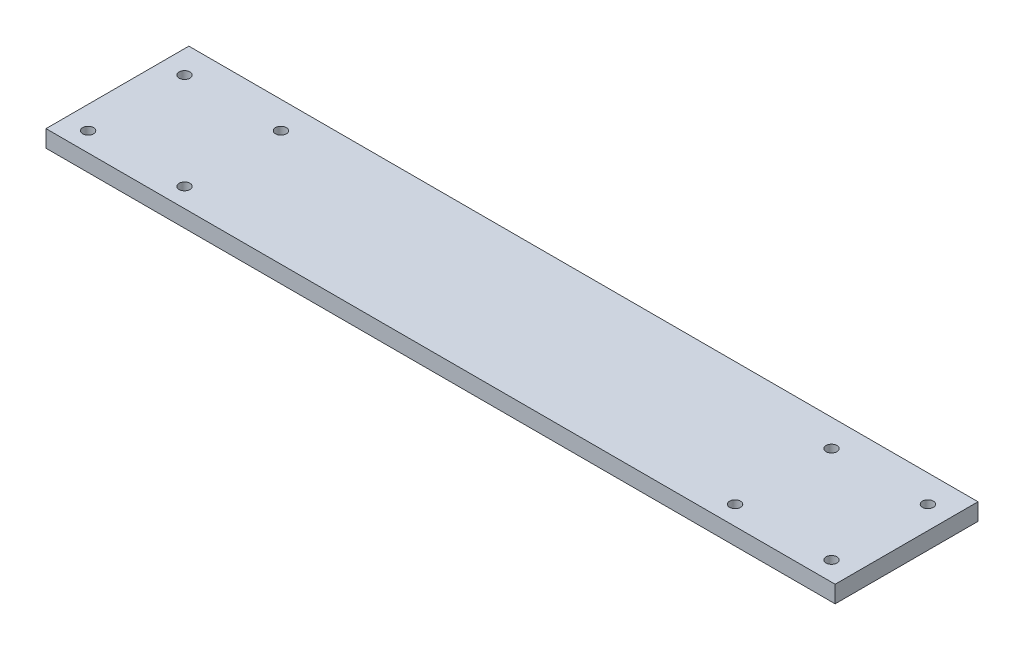
ISO-10303-21;
HEADER;
FILE_DESCRIPTION(('STEP AP214'),'2;1');
FILE_NAME('part.step','',(''),(''),'','','');
FILE_SCHEMA(('AUTOMOTIVE_DESIGN { 1 0 10303 214 1 1 1 1 }'));
ENDSEC;
DATA;
#1=APPLICATION_CONTEXT('core data for automotive mechanical design processes');
#2=APPLICATION_PROTOCOL_DEFINITION('international standard','automotive_design',2000,#1);
#3=PRODUCT_CONTEXT('',#1,'mechanical');
#4=PRODUCT('Part','Part','',(#3));
#5=PRODUCT_RELATED_PRODUCT_CATEGORY('part','',(#4));
#6=PRODUCT_DEFINITION_FORMATION('','',#4);
#7=PRODUCT_DEFINITION_CONTEXT('part definition',#1,'design');
#8=PRODUCT_DEFINITION('design','',#6,#7);
#9=PRODUCT_DEFINITION_SHAPE('','',#8);
#10=(LENGTH_UNIT() NAMED_UNIT(*) SI_UNIT(.MILLI.,.METRE.));
#11=(NAMED_UNIT(*) PLANE_ANGLE_UNIT() SI_UNIT($,.RADIAN.));
#12=(NAMED_UNIT(*) SI_UNIT($,.STERADIAN.) SOLID_ANGLE_UNIT());
#13=UNCERTAINTY_MEASURE_WITH_UNIT(LENGTH_MEASURE(1.E-05),#10,'distance_accuracy_value','');
#14=(GEOMETRIC_REPRESENTATION_CONTEXT(3) GLOBAL_UNCERTAINTY_ASSIGNED_CONTEXT((#13)) GLOBAL_UNIT_ASSIGNED_CONTEXT((#10,
#11,#12)) REPRESENTATION_CONTEXT('',''));
#15=CARTESIAN_POINT('',(0.,0.,0.));
#16=DIRECTION('',(0.,0.,1.));
#17=DIRECTION('',(1.,0.,0.));
#18=AXIS2_PLACEMENT_3D('',#15,#16,#17);
#19=CARTESIAN_POINT('',(0.,3.175,0.));
#20=DIRECTION('',(0.,1.,0.));
#21=DIRECTION('',(0.,0.,1.));
#22=AXIS2_PLACEMENT_3D('',#19,#20,#21);
#23=PLANE('',#22);
#24=CARTESIAN_POINT('',(-69.3885,3.175,-21.59));
#25=DIRECTION('',(0.,1.,0.));
#26=DIRECTION('',(0.,0.,-1.));
#27=AXIS2_PLACEMENT_3D('',#24,#25,#26);
#28=CIRCLE('',#27,1.016);
#29=CARTESIAN_POINT('',(-69.3885,3.175,-22.606));
#30=VERTEX_POINT('',#29);
#31=EDGE_CURVE('E144',#30,#30,#28,.T.);
#32=ORIENTED_EDGE('',*,*,#31,.F.);
#33=EDGE_LOOP('',(#32));
#34=FACE_BOUND('',#33,.T.);
#35=CARTESIAN_POINT('',(-69.3885,3.175,-3.59));
#36=DIRECTION('',(0.,1.,0.));
#37=DIRECTION('',(0.,0.,-1.));
#38=AXIS2_PLACEMENT_3D('',#35,#36,#37);
#39=CIRCLE('',#38,1.016);
#40=CARTESIAN_POINT('',(-69.3885,3.175,-4.60600000000001));
#41=VERTEX_POINT('',#40);
#42=EDGE_CURVE('E132',#41,#41,#39,.T.);
#43=ORIENTED_EDGE('',*,*,#42,.F.);
#44=EDGE_LOOP('',(#43));
#45=FACE_BOUND('',#44,.T.);
#46=CARTESIAN_POINT('',(51.3885,3.175,-3.59000000000002));
#47=DIRECTION('',(0.,1.,0.));
#48=DIRECTION('',(0.,0.,1.));
#49=AXIS2_PLACEMENT_3D('',#46,#47,#48);
#50=CIRCLE('',#49,1.016);
#51=CARTESIAN_POINT('',(51.3885,3.175,-2.57400000000002));
#52=VERTEX_POINT('',#51);
#53=EDGE_CURVE('E120',#52,#52,#50,.T.);
#54=ORIENTED_EDGE('',*,*,#53,.F.);
#55=EDGE_LOOP('',(#54));
#56=FACE_BOUND('',#55,.T.);
#57=CARTESIAN_POINT('',(51.3885,3.175,-21.59));
#58=DIRECTION('',(0.,1.,0.));
#59=DIRECTION('',(0.,0.,1.));
#60=AXIS2_PLACEMENT_3D('',#57,#58,#59);
#61=CIRCLE('',#60,1.016);
#62=CARTESIAN_POINT('',(51.3885,3.175,-20.574));
#63=VERTEX_POINT('',#62);
#64=EDGE_CURVE('E99',#63,#63,#61,.T.);
#65=ORIENTED_EDGE('',*,*,#64,.F.);
#66=EDGE_LOOP('',(#65));
#67=FACE_BOUND('',#66,.T.);
#68=DIRECTION('',(0.,0.,1.));
#69=VECTOR('',#68,1.);
#70=CARTESIAN_POINT('',(-73.66,3.175,0.));
#71=LINE('',#70,#69);
#72=CARTESIAN_POINT('',(-73.66,3.175,-26.67));
#73=VERTEX_POINT('',#72);
#74=CARTESIAN_POINT('',(-73.66,3.175,0.));
#75=VERTEX_POINT('',#74);
#76=EDGE_CURVE('E84',#73,#75,#71,.T.);
#77=ORIENTED_EDGE('',*,*,#76,.T.);
#78=DIRECTION('',(1.,0.,0.));
#79=VECTOR('',#78,1.);
#80=CARTESIAN_POINT('',(73.66,3.175,0.));
#81=LINE('',#80,#79);
#82=CARTESIAN_POINT('',(73.66,3.175,0.));
#83=VERTEX_POINT('',#82);
#84=EDGE_CURVE('E79',#75,#83,#81,.T.);
#85=ORIENTED_EDGE('',*,*,#84,.T.);
#86=DIRECTION('',(0.,0.,-1.));
#87=VECTOR('',#86,1.);
#88=CARTESIAN_POINT('',(73.66,3.175,0.));
#89=LINE('',#88,#87);
#90=CARTESIAN_POINT('',(73.66,3.175,-26.67));
#91=VERTEX_POINT('',#90);
#92=EDGE_CURVE('E82',#83,#91,#89,.T.);
#93=ORIENTED_EDGE('',*,*,#92,.T.);
#94=DIRECTION('',(-1.,0.,0.));
#95=VECTOR('',#94,1.);
#96=CARTESIAN_POINT('',(73.66,3.175,-26.67));
#97=LINE('',#96,#95);
#98=EDGE_CURVE('E49',#91,#73,#97,.T.);
#99=ORIENTED_EDGE('',*,*,#98,.T.);
#100=EDGE_LOOP('',(#77,#85,#93,#99));
#101=FACE_BOUND('',#100,.T.);
#102=CARTESIAN_POINT('',(69.3885,3.175,-21.59));
#103=DIRECTION('',(0.,1.,0.));
#104=DIRECTION('',(0.,0.,1.));
#105=AXIS2_PLACEMENT_3D('',#102,#103,#104);
#106=CIRCLE('',#105,1.016);
#107=CARTESIAN_POINT('',(69.3885,3.175,-20.574));
#108=VERTEX_POINT('',#107);
#109=EDGE_CURVE('E114',#108,#108,#106,.T.);
#110=ORIENTED_EDGE('',*,*,#109,.F.);
#111=EDGE_LOOP('',(#110));
#112=FACE_BOUND('',#111,.T.);
#113=CARTESIAN_POINT('',(69.3885,3.175,-3.59000000000002));
#114=DIRECTION('',(0.,1.,0.));
#115=DIRECTION('',(0.,0.,1.));
#116=AXIS2_PLACEMENT_3D('',#113,#114,#115);
#117=CIRCLE('',#116,1.016);
#118=CARTESIAN_POINT('',(69.3885,3.175,-2.57400000000002));
#119=VERTEX_POINT('',#118);
#120=EDGE_CURVE('E126',#119,#119,#117,.T.);
#121=ORIENTED_EDGE('',*,*,#120,.F.);
#122=EDGE_LOOP('',(#121));
#123=FACE_BOUND('',#122,.T.);
#124=CARTESIAN_POINT('',(-51.3885,3.175,-3.59000000000001));
#125=DIRECTION('',(0.,1.,0.));
#126=DIRECTION('',(0.,0.,-1.));
#127=AXIS2_PLACEMENT_3D('',#124,#125,#126);
#128=CIRCLE('',#127,1.016);
#129=CARTESIAN_POINT('',(-51.3885,3.175,-4.60600000000001));
#130=VERTEX_POINT('',#129);
#131=EDGE_CURVE('E138',#130,#130,#128,.T.);
#132=ORIENTED_EDGE('',*,*,#131,.F.);
#133=EDGE_LOOP('',(#132));
#134=FACE_BOUND('',#133,.T.);
#135=CARTESIAN_POINT('',(-51.3885,3.175,-21.59));
#136=DIRECTION('',(0.,1.,0.));
#137=DIRECTION('',(0.,0.,-1.));
#138=AXIS2_PLACEMENT_3D('',#135,#136,#137);
#139=CIRCLE('',#138,1.016);
#140=CARTESIAN_POINT('',(-51.3885,3.175,-22.606));
#141=VERTEX_POINT('',#140);
#142=EDGE_CURVE('E150',#141,#141,#139,.T.);
#143=ORIENTED_EDGE('',*,*,#142,.F.);
#144=EDGE_LOOP('',(#143));
#145=FACE_BOUND('',#144,.T.);
#146=ADVANCED_FACE('F32',(#34,#45,#56,#67,#101,#112,#123,#134,#145),#23,.T.);
#147=CARTESIAN_POINT('',(0.,0.,0.));
#148=DIRECTION('',(0.,1.,0.));
#149=DIRECTION('',(0.,0.,1.));
#150=AXIS2_PLACEMENT_3D('',#147,#148,#149);
#151=PLANE('',#150);
#152=DIRECTION('',(0.,0.,1.));
#153=VECTOR('',#152,1.);
#154=CARTESIAN_POINT('',(-73.66,0.,0.));
#155=LINE('',#154,#153);
#156=CARTESIAN_POINT('',(-73.66,0.,-26.67));
#157=VERTEX_POINT('',#156);
#158=CARTESIAN_POINT('',(-73.66,0.,0.));
#159=VERTEX_POINT('',#158);
#160=EDGE_CURVE('E96',#157,#159,#155,.T.);
#161=ORIENTED_EDGE('',*,*,#160,.F.);
#162=DIRECTION('',(-1.,0.,0.));
#163=VECTOR('',#162,1.);
#164=CARTESIAN_POINT('',(73.66,0.,-26.67));
#165=LINE('',#164,#163);
#166=CARTESIAN_POINT('',(73.66,0.,-26.67));
#167=VERTEX_POINT('',#166);
#168=EDGE_CURVE('E72',#167,#157,#165,.T.);
#169=ORIENTED_EDGE('',*,*,#168,.F.);
#170=DIRECTION('',(0.,0.,-1.));
#171=VECTOR('',#170,1.);
#172=CARTESIAN_POINT('',(73.66,0.,0.));
#173=LINE('',#172,#171);
#174=CARTESIAN_POINT('',(73.66,0.,0.));
#175=VERTEX_POINT('',#174);
#176=EDGE_CURVE('E66',#175,#167,#173,.T.);
#177=ORIENTED_EDGE('',*,*,#176,.F.);
#178=DIRECTION('',(1.,0.,0.));
#179=VECTOR('',#178,1.);
#180=CARTESIAN_POINT('',(73.66,0.,0.));
#181=LINE('',#180,#179);
#182=EDGE_CURVE('E88',#159,#175,#181,.T.);
#183=ORIENTED_EDGE('',*,*,#182,.F.);
#184=EDGE_LOOP('',(#161,#169,#177,#183));
#185=FACE_BOUND('',#184,.T.);
#186=CARTESIAN_POINT('',(51.3885,0.,-21.59));
#187=DIRECTION('',(0.,1.,0.));
#188=DIRECTION('',(0.,0.,1.));
#189=AXIS2_PLACEMENT_3D('',#186,#187,#188);
#190=CIRCLE('',#189,1.016);
#191=CARTESIAN_POINT('',(51.3885,0.,-20.574));
#192=VERTEX_POINT('',#191);
#193=EDGE_CURVE('E111',#192,#192,#190,.T.);
#194=ORIENTED_EDGE('',*,*,#193,.T.);
#195=EDGE_LOOP('',(#194));
#196=FACE_BOUND('',#195,.T.);
#197=CARTESIAN_POINT('',(69.3885,0.,-21.59));
#198=DIRECTION('',(0.,1.,0.));
#199=DIRECTION('',(0.,0.,1.));
#200=AXIS2_PLACEMENT_3D('',#197,#198,#199);
#201=CIRCLE('',#200,1.016);
#202=CARTESIAN_POINT('',(69.3885,0.,-20.574));
#203=VERTEX_POINT('',#202);
#204=EDGE_CURVE('E117',#203,#203,#201,.T.);
#205=ORIENTED_EDGE('',*,*,#204,.T.);
#206=EDGE_LOOP('',(#205));
#207=FACE_BOUND('',#206,.T.);
#208=CARTESIAN_POINT('',(51.3885,0.,-3.59000000000002));
#209=DIRECTION('',(0.,1.,0.));
#210=DIRECTION('',(0.,0.,1.));
#211=AXIS2_PLACEMENT_3D('',#208,#209,#210);
#212=CIRCLE('',#211,1.016);
#213=CARTESIAN_POINT('',(51.3885,0.,-2.57400000000002));
#214=VERTEX_POINT('',#213);
#215=EDGE_CURVE('E123',#214,#214,#212,.T.);
#216=ORIENTED_EDGE('',*,*,#215,.T.);
#217=EDGE_LOOP('',(#216));
#218=FACE_BOUND('',#217,.T.);
#219=CARTESIAN_POINT('',(69.3885,0.,-3.59000000000002));
#220=DIRECTION('',(0.,1.,0.));
#221=DIRECTION('',(0.,0.,1.));
#222=AXIS2_PLACEMENT_3D('',#219,#220,#221);
#223=CIRCLE('',#222,1.016);
#224=CARTESIAN_POINT('',(69.3885,0.,-2.57400000000002));
#225=VERTEX_POINT('',#224);
#226=EDGE_CURVE('E129',#225,#225,#223,.T.);
#227=ORIENTED_EDGE('',*,*,#226,.T.);
#228=EDGE_LOOP('',(#227));
#229=FACE_BOUND('',#228,.T.);
#230=CARTESIAN_POINT('',(-69.3885,0.,-3.59));
#231=DIRECTION('',(0.,1.,0.));
#232=DIRECTION('',(0.,0.,-1.));
#233=AXIS2_PLACEMENT_3D('',#230,#231,#232);
#234=CIRCLE('',#233,1.016);
#235=CARTESIAN_POINT('',(-69.3885,0.,-4.60600000000001));
#236=VERTEX_POINT('',#235);
#237=EDGE_CURVE('E135',#236,#236,#234,.T.);
#238=ORIENTED_EDGE('',*,*,#237,.T.);
#239=EDGE_LOOP('',(#238));
#240=FACE_BOUND('',#239,.T.);
#241=CARTESIAN_POINT('',(-51.3885,0.,-3.59000000000001));
#242=DIRECTION('',(0.,1.,0.));
#243=DIRECTION('',(0.,0.,-1.));
#244=AXIS2_PLACEMENT_3D('',#241,#242,#243);
#245=CIRCLE('',#244,1.016);
#246=CARTESIAN_POINT('',(-51.3885,0.,-4.60600000000001));
#247=VERTEX_POINT('',#246);
#248=EDGE_CURVE('E141',#247,#247,#245,.T.);
#249=ORIENTED_EDGE('',*,*,#248,.T.);
#250=EDGE_LOOP('',(#249));
#251=FACE_BOUND('',#250,.T.);
#252=CARTESIAN_POINT('',(-69.3885,0.,-21.59));
#253=DIRECTION('',(0.,1.,0.));
#254=DIRECTION('',(0.,0.,-1.));
#255=AXIS2_PLACEMENT_3D('',#252,#253,#254);
#256=CIRCLE('',#255,1.016);
#257=CARTESIAN_POINT('',(-69.3885,0.,-22.606));
#258=VERTEX_POINT('',#257);
#259=EDGE_CURVE('E147',#258,#258,#256,.T.);
#260=ORIENTED_EDGE('',*,*,#259,.T.);
#261=EDGE_LOOP('',(#260));
#262=FACE_BOUND('',#261,.T.);
#263=CARTESIAN_POINT('',(-51.3885,0.,-21.59));
#264=DIRECTION('',(0.,1.,0.));
#265=DIRECTION('',(0.,0.,-1.));
#266=AXIS2_PLACEMENT_3D('',#263,#264,#265);
#267=CIRCLE('',#266,1.016);
#268=CARTESIAN_POINT('',(-51.3885,0.,-22.606));
#269=VERTEX_POINT('',#268);
#270=EDGE_CURVE('E153',#269,#269,#267,.T.);
#271=ORIENTED_EDGE('',*,*,#270,.T.);
#272=EDGE_LOOP('',(#271));
#273=FACE_BOUND('',#272,.T.);
#274=ADVANCED_FACE('F107',(#185,#196,#207,#218,#229,#240,#251,#262,#273),#151,.F.);
#275=CARTESIAN_POINT('',(-73.66,3.175,0.));
#276=DIRECTION('',(1.,0.,0.));
#277=DIRECTION('',(0.,0.,-1.));
#278=AXIS2_PLACEMENT_3D('',#275,#276,#277);
#279=PLANE('',#278);
#280=ORIENTED_EDGE('',*,*,#160,.T.);
#281=DIRECTION('',(0.,-1.,0.));
#282=VECTOR('',#281,1.);
#283=CARTESIAN_POINT('',(-73.66,3.175,0.));
#284=LINE('',#283,#282);
#285=EDGE_CURVE('E11',#75,#159,#284,.T.);
#286=ORIENTED_EDGE('',*,*,#285,.F.);
#287=ORIENTED_EDGE('',*,*,#76,.F.);
#288=DIRECTION('',(0.,-1.,0.));
#289=VECTOR('',#288,1.);
#290=CARTESIAN_POINT('',(-73.66,3.175,-26.67));
#291=LINE('',#290,#289);
#292=EDGE_CURVE('E92',#73,#157,#291,.T.);
#293=ORIENTED_EDGE('',*,*,#292,.T.);
#294=EDGE_LOOP('',(#280,#286,#287,#293));
#295=FACE_BOUND('',#294,.T.);
#296=ADVANCED_FACE('F34',(#295),#279,.F.);
#297=CARTESIAN_POINT('',(73.66,3.175,0.));
#298=DIRECTION('',(0.,0.,-1.));
#299=DIRECTION('',(-1.,0.,0.));
#300=AXIS2_PLACEMENT_3D('',#297,#298,#299);
#301=PLANE('',#300);
#302=ORIENTED_EDGE('',*,*,#182,.T.);
#303=DIRECTION('',(0.,-1.,0.));
#304=VECTOR('',#303,1.);
#305=CARTESIAN_POINT('',(73.66,3.175,0.));
#306=LINE('',#305,#304);
#307=EDGE_CURVE('E41',#83,#175,#306,.T.);
#308=ORIENTED_EDGE('',*,*,#307,.F.);
#309=ORIENTED_EDGE('',*,*,#84,.F.);
#310=ORIENTED_EDGE('',*,*,#285,.T.);
#311=EDGE_LOOP('',(#302,#308,#309,#310));
#312=FACE_BOUND('',#311,.T.);
#313=ADVANCED_FACE('F87',(#312),#301,.F.);
#314=CARTESIAN_POINT('',(73.66,3.175,0.));
#315=DIRECTION('',(-1.,0.,0.));
#316=DIRECTION('',(0.,0.,1.));
#317=AXIS2_PLACEMENT_3D('',#314,#315,#316);
#318=PLANE('',#317);
#319=ORIENTED_EDGE('',*,*,#176,.T.);
#320=DIRECTION('',(0.,-1.,0.));
#321=VECTOR('',#320,1.);
#322=CARTESIAN_POINT('',(73.66,3.175,-26.67));
#323=LINE('',#322,#321);
#324=EDGE_CURVE('E89',#91,#167,#323,.T.);
#325=ORIENTED_EDGE('',*,*,#324,.F.);
#326=ORIENTED_EDGE('',*,*,#92,.F.);
#327=ORIENTED_EDGE('',*,*,#307,.T.);
#328=EDGE_LOOP('',(#319,#325,#326,#327));
#329=FACE_BOUND('',#328,.T.);
#330=ADVANCED_FACE('F90',(#329),#318,.F.);
#331=CARTESIAN_POINT('',(73.66,3.175,-26.67));
#332=DIRECTION('',(0.,0.,1.));
#333=DIRECTION('',(1.,0.,0.));
#334=AXIS2_PLACEMENT_3D('',#331,#332,#333);
#335=PLANE('',#334);
#336=ORIENTED_EDGE('',*,*,#168,.T.);
#337=ORIENTED_EDGE('',*,*,#292,.F.);
#338=ORIENTED_EDGE('',*,*,#98,.F.);
#339=ORIENTED_EDGE('',*,*,#324,.T.);
#340=EDGE_LOOP('',(#336,#337,#338,#339));
#341=FACE_BOUND('',#340,.T.);
#342=ADVANCED_FACE('F104',(#341),#335,.F.);
#343=CARTESIAN_POINT('',(51.3885,3.175,-21.59));
#344=DIRECTION('',(0.,-1.,0.));
#345=DIRECTION('',(0.,0.,-1.));
#346=AXIS2_PLACEMENT_3D('',#343,#344,#345);
#347=CYLINDRICAL_SURFACE('',#346,1.016);
#348=ORIENTED_EDGE('',*,*,#64,.T.);
#349=EDGE_LOOP('',(#348));
#350=FACE_BOUND('',#349,.T.);
#351=ORIENTED_EDGE('',*,*,#193,.F.);
#352=EDGE_LOOP('',(#351));
#353=FACE_BOUND('',#352,.T.);
#354=ADVANCED_FACE('F172',(#350,#353),#347,.F.);
#355=CARTESIAN_POINT('',(69.3885,3.175,-21.59));
#356=DIRECTION('',(0.,-1.,0.));
#357=DIRECTION('',(0.,0.,-1.));
#358=AXIS2_PLACEMENT_3D('',#355,#356,#357);
#359=CYLINDRICAL_SURFACE('',#358,1.016);
#360=ORIENTED_EDGE('',*,*,#109,.T.);
#361=EDGE_LOOP('',(#360));
#362=FACE_BOUND('',#361,.T.);
#363=ORIENTED_EDGE('',*,*,#204,.F.);
#364=EDGE_LOOP('',(#363));
#365=FACE_BOUND('',#364,.T.);
#366=ADVANCED_FACE('F218',(#362,#365),#359,.F.);
#367=CARTESIAN_POINT('',(51.3885,3.175,-3.59000000000002));
#368=DIRECTION('',(0.,-1.,0.));
#369=DIRECTION('',(0.,0.,-1.));
#370=AXIS2_PLACEMENT_3D('',#367,#368,#369);
#371=CYLINDRICAL_SURFACE('',#370,1.016);
#372=ORIENTED_EDGE('',*,*,#53,.T.);
#373=EDGE_LOOP('',(#372));
#374=FACE_BOUND('',#373,.T.);
#375=ORIENTED_EDGE('',*,*,#215,.F.);
#376=EDGE_LOOP('',(#375));
#377=FACE_BOUND('',#376,.T.);
#378=ADVANCED_FACE('F226',(#374,#377),#371,.F.);
#379=CARTESIAN_POINT('',(69.3885,3.175,-3.59000000000002));
#380=DIRECTION('',(0.,-1.,0.));
#381=DIRECTION('',(0.,0.,-1.));
#382=AXIS2_PLACEMENT_3D('',#379,#380,#381);
#383=CYLINDRICAL_SURFACE('',#382,1.016);
#384=ORIENTED_EDGE('',*,*,#120,.T.);
#385=EDGE_LOOP('',(#384));
#386=FACE_BOUND('',#385,.T.);
#387=ORIENTED_EDGE('',*,*,#226,.F.);
#388=EDGE_LOOP('',(#387));
#389=FACE_BOUND('',#388,.T.);
#390=ADVANCED_FACE('F234',(#386,#389),#383,.F.);
#391=CARTESIAN_POINT('',(-69.3885,3.175,-3.59));
#392=DIRECTION('',(0.,-1.,0.));
#393=DIRECTION('',(0.,0.,-1.));
#394=AXIS2_PLACEMENT_3D('',#391,#392,#393);
#395=CYLINDRICAL_SURFACE('',#394,1.016);
#396=ORIENTED_EDGE('',*,*,#42,.T.);
#397=EDGE_LOOP('',(#396));
#398=FACE_BOUND('',#397,.T.);
#399=ORIENTED_EDGE('',*,*,#237,.F.);
#400=EDGE_LOOP('',(#399));
#401=FACE_BOUND('',#400,.T.);
#402=ADVANCED_FACE('F243',(#398,#401),#395,.F.);
#403=CARTESIAN_POINT('',(-51.3885,3.175,-3.59000000000001));
#404=DIRECTION('',(0.,-1.,0.));
#405=DIRECTION('',(0.,0.,-1.));
#406=AXIS2_PLACEMENT_3D('',#403,#404,#405);
#407=CYLINDRICAL_SURFACE('',#406,1.016);
#408=ORIENTED_EDGE('',*,*,#131,.T.);
#409=EDGE_LOOP('',(#408));
#410=FACE_BOUND('',#409,.T.);
#411=ORIENTED_EDGE('',*,*,#248,.F.);
#412=EDGE_LOOP('',(#411));
#413=FACE_BOUND('',#412,.T.);
#414=ADVANCED_FACE('F252',(#410,#413),#407,.F.);
#415=CARTESIAN_POINT('',(-69.3885,3.175,-21.59));
#416=DIRECTION('',(0.,-1.,0.));
#417=DIRECTION('',(0.,0.,-1.));
#418=AXIS2_PLACEMENT_3D('',#415,#416,#417);
#419=CYLINDRICAL_SURFACE('',#418,1.016);
#420=ORIENTED_EDGE('',*,*,#31,.T.);
#421=EDGE_LOOP('',(#420));
#422=FACE_BOUND('',#421,.T.);
#423=ORIENTED_EDGE('',*,*,#259,.F.);
#424=EDGE_LOOP('',(#423));
#425=FACE_BOUND('',#424,.T.);
#426=ADVANCED_FACE('F261',(#422,#425),#419,.F.);
#427=CARTESIAN_POINT('',(-51.3885,3.175,-21.59));
#428=DIRECTION('',(0.,-1.,0.));
#429=DIRECTION('',(0.,0.,-1.));
#430=AXIS2_PLACEMENT_3D('',#427,#428,#429);
#431=CYLINDRICAL_SURFACE('',#430,1.016);
#432=ORIENTED_EDGE('',*,*,#142,.T.);
#433=EDGE_LOOP('',(#432));
#434=FACE_BOUND('',#433,.T.);
#435=ORIENTED_EDGE('',*,*,#270,.F.);
#436=EDGE_LOOP('',(#435));
#437=FACE_BOUND('',#436,.T.);
#438=ADVANCED_FACE('F159',(#434,#437),#431,.F.);
#439=CLOSED_SHELL('',(#146,#274,#296,#313,#330,#342,#354,#366,#378,#390,#402,#414,#426,#438));
#440=MANIFOLD_SOLID_BREP('B2',#439);
#441=ADVANCED_BREP_SHAPE_REPRESENTATION('',(#18,#440),#14);
#442=SHAPE_DEFINITION_REPRESENTATION(#9,#441);
ENDSEC;
END-ISO-10303-21;
